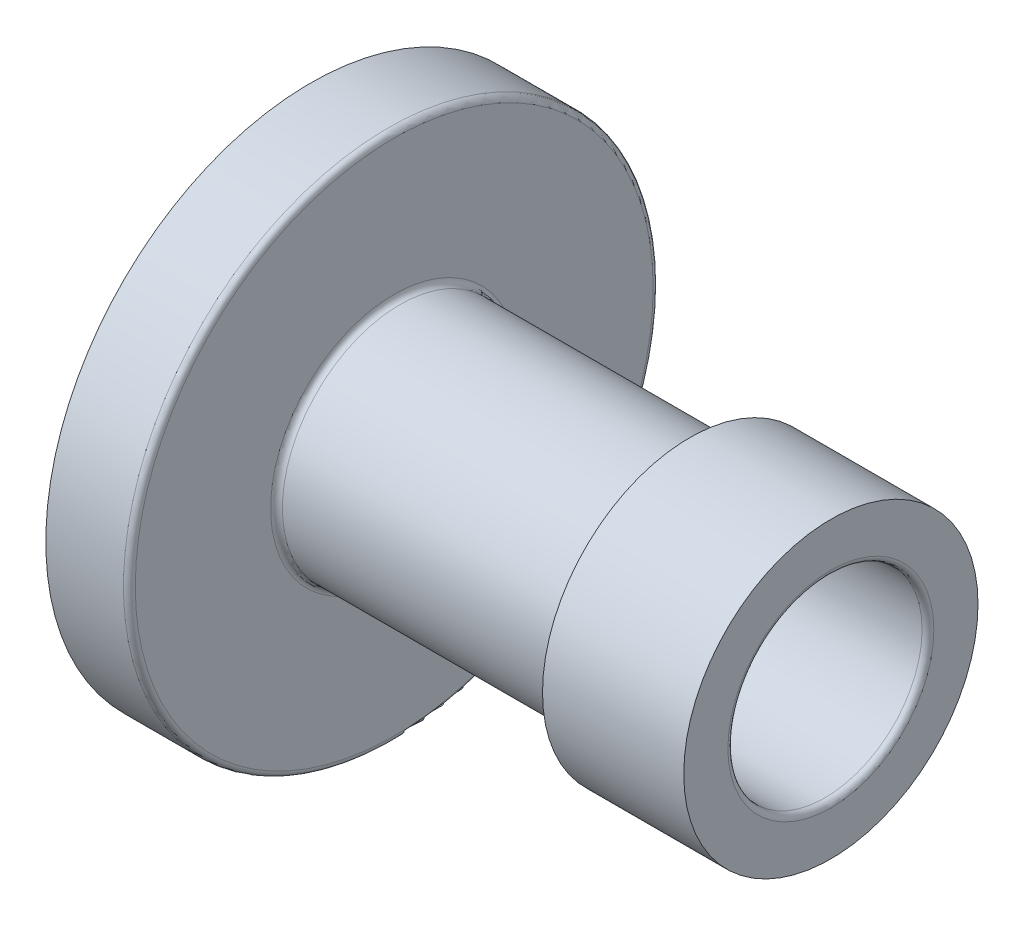
ISO-10303-21;
HEADER;
FILE_DESCRIPTION(('STEP AP214'),'2;1');
FILE_NAME('part.step','',(''),(''),'','','');
FILE_SCHEMA(('AUTOMOTIVE_DESIGN { 1 0 10303 214 1 1 1 1 }'));
ENDSEC;
DATA;
#1=APPLICATION_CONTEXT('core data for automotive mechanical design processes');
#2=APPLICATION_PROTOCOL_DEFINITION('international standard','automotive_design',2000,#1);
#3=PRODUCT_CONTEXT('',#1,'mechanical');
#4=PRODUCT('Part','Part','',(#3));
#5=PRODUCT_RELATED_PRODUCT_CATEGORY('part','',(#4));
#6=PRODUCT_DEFINITION_FORMATION('','',#4);
#7=PRODUCT_DEFINITION_CONTEXT('part definition',#1,'design');
#8=PRODUCT_DEFINITION('design','',#6,#7);
#9=PRODUCT_DEFINITION_SHAPE('','',#8);
#10=(LENGTH_UNIT() NAMED_UNIT(*) SI_UNIT(.MILLI.,.METRE.));
#11=(NAMED_UNIT(*) PLANE_ANGLE_UNIT() SI_UNIT($,.RADIAN.));
#12=(NAMED_UNIT(*) SI_UNIT($,.STERADIAN.) SOLID_ANGLE_UNIT());
#13=UNCERTAINTY_MEASURE_WITH_UNIT(LENGTH_MEASURE(1.E-05),#10,'distance_accuracy_value','');
#14=(GEOMETRIC_REPRESENTATION_CONTEXT(3) GLOBAL_UNCERTAINTY_ASSIGNED_CONTEXT((#13)) GLOBAL_UNIT_ASSIGNED_CONTEXT((#10,
#11,#12)) REPRESENTATION_CONTEXT('',''));
#15=CARTESIAN_POINT('',(0.,0.,0.));
#16=DIRECTION('',(0.,0.,1.));
#17=DIRECTION('',(1.,0.,0.));
#18=AXIS2_PLACEMENT_3D('',#15,#16,#17);
#19=CARTESIAN_POINT('',(-44.2,15.,0.));
#20=DIRECTION('',(-1.,0.,0.));
#21=DIRECTION('',(0.,0.,1.));
#22=AXIS2_PLACEMENT_3D('',#19,#20,#21);
#23=PLANE('',#22);
#24=CARTESIAN_POINT('',(-44.2,15.,0.));
#25=DIRECTION('',(1.,0.,0.));
#26=DIRECTION('',(0.,0.,-1.));
#27=AXIS2_PLACEMENT_3D('',#24,#25,#26);
#28=CIRCLE('',#27,15.);
#29=CARTESIAN_POINT('',(-44.2,15.,-15.));
#30=VERTEX_POINT('',#29);
#31=EDGE_CURVE('E80',#30,#30,#28,.T.);
#32=ORIENTED_EDGE('',*,*,#31,.T.);
#33=EDGE_LOOP('',(#32));
#34=FACE_BOUND('',#33,.T.);
#35=CARTESIAN_POINT('',(-44.2,15.,0.));
#36=DIRECTION('',(1.,0.,0.));
#37=DIRECTION('',(0.,0.,-1.));
#38=AXIS2_PLACEMENT_3D('',#35,#36,#37);
#39=CIRCLE('',#38,45.);
#40=CARTESIAN_POINT('',(-44.2,15.,-45.));
#41=VERTEX_POINT('',#40);
#42=EDGE_CURVE('E75',#41,#41,#39,.T.);
#43=ORIENTED_EDGE('',*,*,#42,.F.);
#44=EDGE_LOOP('',(#43));
#45=FACE_BOUND('',#44,.T.);
#46=ADVANCED_FACE('F43',(#34,#45),#23,.T.);
#47=CARTESIAN_POINT('',(44.2,15.,0.));
#48=DIRECTION('',(1.,0.,0.));
#49=DIRECTION('',(0.,0.,-1.));
#50=AXIS2_PLACEMENT_3D('',#47,#48,#49);
#51=CYLINDRICAL_SURFACE('',#50,45.);
#52=CARTESIAN_POINT('',(-31.,15.,0.));
#53=DIRECTION('',(1.,0.,0.));
#54=DIRECTION('',(0.,0.,-1.));
#55=AXIS2_PLACEMENT_3D('',#52,#53,#54);
#56=CIRCLE('',#55,45.);
#57=CARTESIAN_POINT('',(-31.,15.,-45.));
#58=VERTEX_POINT('',#57);
#59=EDGE_CURVE('E56',#58,#58,#56,.F.);
#60=ORIENTED_EDGE('',*,*,#59,.T.);
#61=EDGE_LOOP('',(#60));
#62=FACE_BOUND('',#61,.T.);
#63=ORIENTED_EDGE('',*,*,#42,.T.);
#64=EDGE_LOOP('',(#63));
#65=FACE_BOUND('',#64,.T.);
#66=ADVANCED_FACE('F122',(#62,#65),#51,.T.);
#67=CARTESIAN_POINT('',(-30.,60.,0.));
#68=DIRECTION('',(1.,0.,0.));
#69=DIRECTION('',(0.,0.,-1.));
#70=AXIS2_PLACEMENT_3D('',#67,#68,#69);
#71=PLANE('',#70);
#72=CARTESIAN_POINT('',(-30.,15.,0.));
#73=DIRECTION('',(1.,0.,0.));
#74=DIRECTION('',(0.,0.,-1.));
#75=AXIS2_PLACEMENT_3D('',#72,#73,#74);
#76=CIRCLE('',#75,21.);
#77=CARTESIAN_POINT('',(-30.,15.,-21.));
#78=VERTEX_POINT('',#77);
#79=EDGE_CURVE('E61',#78,#78,#76,.F.);
#80=ORIENTED_EDGE('',*,*,#79,.T.);
#81=EDGE_LOOP('',(#80));
#82=FACE_BOUND('',#81,.T.);
#83=CARTESIAN_POINT('',(-30.,15.,0.));
#84=DIRECTION('',(1.,0.,0.));
#85=DIRECTION('',(0.,0.,-1.));
#86=AXIS2_PLACEMENT_3D('',#83,#84,#85);
#87=CIRCLE('',#86,44.);
#88=CARTESIAN_POINT('',(-30.,15.,-44.));
#89=VERTEX_POINT('',#88);
#90=EDGE_CURVE('E67',#89,#89,#87,.T.);
#91=ORIENTED_EDGE('',*,*,#90,.T.);
#92=EDGE_LOOP('',(#91));
#93=FACE_BOUND('',#92,.T.);
#94=ADVANCED_FACE('F130',(#82,#93),#71,.T.);
#95=CARTESIAN_POINT('',(44.2,15.,0.));
#96=DIRECTION('',(1.,0.,0.));
#97=DIRECTION('',(0.,0.,-1.));
#98=AXIS2_PLACEMENT_3D('',#95,#96,#97);
#99=CYLINDRICAL_SURFACE('',#98,20.);
#100=CARTESIAN_POINT('',(-29.,15.,0.));
#101=DIRECTION('',(1.,0.,0.));
#102=DIRECTION('',(0.,0.,-1.));
#103=AXIS2_PLACEMENT_3D('',#100,#101,#102);
#104=CIRCLE('',#103,20.);
#105=CARTESIAN_POINT('',(-29.,15.,-20.));
#106=VERTEX_POINT('',#105);
#107=EDGE_CURVE('E71',#106,#106,#104,.T.);
#108=ORIENTED_EDGE('',*,*,#107,.T.);
#109=EDGE_LOOP('',(#108));
#110=FACE_BOUND('',#109,.T.);
#111=CARTESIAN_POINT('',(20.2,15.,0.));
#112=DIRECTION('',(1.,0.,0.));
#113=DIRECTION('',(0.,0.,-1.));
#114=AXIS2_PLACEMENT_3D('',#111,#112,#113);
#115=CIRCLE('',#114,20.);
#116=CARTESIAN_POINT('',(20.2,15.,-20.));
#117=VERTEX_POINT('',#116);
#118=EDGE_CURVE('E85',#117,#117,#115,.T.);
#119=ORIENTED_EDGE('',*,*,#118,.F.);
#120=EDGE_LOOP('',(#119));
#121=FACE_BOUND('',#120,.T.);
#122=ADVANCED_FACE('F146',(#110,#121),#99,.T.);
#123=CARTESIAN_POINT('',(20.2,35.,0.));
#124=DIRECTION('',(-1.,0.,0.));
#125=DIRECTION('',(0.,0.,1.));
#126=AXIS2_PLACEMENT_3D('',#123,#124,#125);
#127=PLANE('',#126);
#128=ORIENTED_EDGE('',*,*,#118,.T.);
#129=EDGE_LOOP('',(#128));
#130=FACE_BOUND('',#129,.T.);
#131=CARTESIAN_POINT('',(20.2,15.,0.));
#132=DIRECTION('',(1.,0.,0.));
#133=DIRECTION('',(0.,0.,-1.));
#134=AXIS2_PLACEMENT_3D('',#131,#132,#133);
#135=CIRCLE('',#134,25.);
#136=CARTESIAN_POINT('',(20.2,15.,-25.));
#137=VERTEX_POINT('',#136);
#138=EDGE_CURVE('E89',#137,#137,#135,.T.);
#139=ORIENTED_EDGE('',*,*,#138,.F.);
#140=EDGE_LOOP('',(#139));
#141=FACE_BOUND('',#140,.T.);
#142=ADVANCED_FACE('F151',(#130,#141),#127,.T.);
#143=CARTESIAN_POINT('',(44.2,15.,0.));
#144=DIRECTION('',(1.,0.,0.));
#145=DIRECTION('',(0.,0.,-1.));
#146=AXIS2_PLACEMENT_3D('',#143,#144,#145);
#147=CYLINDRICAL_SURFACE('',#146,25.);
#148=ORIENTED_EDGE('',*,*,#138,.T.);
#149=EDGE_LOOP('',(#148));
#150=FACE_BOUND('',#149,.T.);
#151=CARTESIAN_POINT('',(44.2,15.,0.));
#152=DIRECTION('',(1.,0.,0.));
#153=DIRECTION('',(0.,0.,-1.));
#154=AXIS2_PLACEMENT_3D('',#151,#152,#153);
#155=CIRCLE('',#154,25.);
#156=CARTESIAN_POINT('',(44.2,15.,-25.));
#157=VERTEX_POINT('',#156);
#158=EDGE_CURVE('E93',#157,#157,#155,.T.);
#159=ORIENTED_EDGE('',*,*,#158,.F.);
#160=EDGE_LOOP('',(#159));
#161=FACE_BOUND('',#160,.T.);
#162=ADVANCED_FACE('F157',(#150,#161),#147,.T.);
#163=CARTESIAN_POINT('',(44.2,40.,0.));
#164=DIRECTION('',(1.,0.,0.));
#165=DIRECTION('',(0.,0.,-1.));
#166=AXIS2_PLACEMENT_3D('',#163,#164,#165);
#167=PLANE('',#166);
#168=CARTESIAN_POINT('',(44.2,15.,0.));
#169=DIRECTION('',(1.,0.,0.));
#170=DIRECTION('',(0.,0.,-1.));
#171=AXIS2_PLACEMENT_3D('',#168,#169,#170);
#172=CIRCLE('',#171,17.5);
#173=CARTESIAN_POINT('',(44.2,15.,-17.5));
#174=VERTEX_POINT('',#173);
#175=EDGE_CURVE('E10',#174,#174,#172,.F.);
#176=ORIENTED_EDGE('',*,*,#175,.T.);
#177=EDGE_LOOP('',(#176));
#178=FACE_BOUND('',#177,.T.);
#179=ORIENTED_EDGE('',*,*,#158,.T.);
#180=EDGE_LOOP('',(#179));
#181=FACE_BOUND('',#180,.T.);
#182=ADVANCED_FACE('F160',(#178,#181),#167,.T.);
#183=CARTESIAN_POINT('',(44.2,15.,0.));
#184=DIRECTION('',(1.,0.,0.));
#185=DIRECTION('',(0.,0.,-1.));
#186=AXIS2_PLACEMENT_3D('',#183,#184,#185);
#187=CYLINDRICAL_SURFACE('',#186,15.);
#188=CARTESIAN_POINT('',(14.2,15.,0.));
#189=DIRECTION('',(-1.,0.,0.));
#190=DIRECTION('',(0.,0.,1.));
#191=AXIS2_PLACEMENT_3D('',#188,#189,#190);
#192=CIRCLE('',#191,15.);
#193=CARTESIAN_POINT('',(14.2,15.,15.));
#194=VERTEX_POINT('',#193);
#195=EDGE_CURVE('E76',#194,#194,#192,.F.);
#196=ORIENTED_EDGE('',*,*,#195,.T.);
#197=EDGE_LOOP('',(#196));
#198=FACE_BOUND('',#197,.T.);
#199=ORIENTED_EDGE('',*,*,#31,.F.);
#200=EDGE_LOOP('',(#199));
#201=FACE_BOUND('',#200,.T.);
#202=ADVANCED_FACE('F119',(#198,#201),#187,.F.);
#203=CARTESIAN_POINT('',(14.2,15.,0.));
#204=DIRECTION('',(-1.,0.,0.));
#205=DIRECTION('',(0.,0.,1.));
#206=AXIS2_PLACEMENT_3D('',#203,#204,#205);
#207=PLANE('',#206);
#208=CARTESIAN_POINT('',(14.2,15.,0.));
#209=DIRECTION('',(1.,0.,0.));
#210=DIRECTION('',(0.,0.,-1.));
#211=AXIS2_PLACEMENT_3D('',#208,#209,#210);
#212=CIRCLE('',#211,16.5);
#213=CARTESIAN_POINT('',(14.2,15.,-16.5));
#214=VERTEX_POINT('',#213);
#215=EDGE_CURVE('E81',#214,#214,#212,.T.);
#216=ORIENTED_EDGE('',*,*,#215,.T.);
#217=EDGE_LOOP('',(#216));
#218=FACE_BOUND('',#217,.T.);
#219=ORIENTED_EDGE('',*,*,#195,.F.);
#220=EDGE_LOOP('',(#219));
#221=FACE_BOUND('',#220,.T.);
#222=ADVANCED_FACE('F104',(#218,#221),#207,.F.);
#223=CARTESIAN_POINT('',(44.2,15.,0.));
#224=DIRECTION('',(1.,0.,0.));
#225=DIRECTION('',(0.,0.,-1.));
#226=AXIS2_PLACEMENT_3D('',#223,#224,#225);
#227=CYLINDRICAL_SURFACE('',#226,16.5);
#228=CARTESIAN_POINT('',(43.2,15.,0.));
#229=DIRECTION('',(1.,0.,0.));
#230=DIRECTION('',(0.,0.,-1.));
#231=AXIS2_PLACEMENT_3D('',#228,#229,#230);
#232=CIRCLE('',#231,16.5);
#233=CARTESIAN_POINT('',(43.2,15.,-16.5));
#234=VERTEX_POINT('',#233);
#235=EDGE_CURVE('E51',#234,#234,#232,.T.);
#236=ORIENTED_EDGE('',*,*,#235,.T.);
#237=EDGE_LOOP('',(#236));
#238=FACE_BOUND('',#237,.T.);
#239=ORIENTED_EDGE('',*,*,#215,.F.);
#240=EDGE_LOOP('',(#239));
#241=FACE_BOUND('',#240,.T.);
#242=ADVANCED_FACE('F107',(#238,#241),#227,.F.);
#243=CARTESIAN_POINT('',(-29.,15.,0.));
#244=DIRECTION('',(1.,0.,0.));
#245=DIRECTION('',(0.,0.,-1.));
#246=AXIS2_PLACEMENT_3D('',#243,#244,#245);
#247=TOROIDAL_SURFACE('',#246,21.,1.);
#248=ORIENTED_EDGE('',*,*,#79,.F.);
#249=EDGE_LOOP('',(#248));
#250=FACE_BOUND('',#249,.T.);
#251=ORIENTED_EDGE('',*,*,#107,.F.);
#252=EDGE_LOOP('',(#251));
#253=FACE_BOUND('',#252,.T.);
#254=ADVANCED_FACE('F109',(#250,#253),#247,.F.);
#255=CARTESIAN_POINT('',(-31.,15.,0.));
#256=DIRECTION('',(1.,0.,0.));
#257=DIRECTION('',(0.,0.,-1.));
#258=AXIS2_PLACEMENT_3D('',#255,#256,#257);
#259=TOROIDAL_SURFACE('',#258,44.,1.);
#260=ORIENTED_EDGE('',*,*,#59,.F.);
#261=EDGE_LOOP('',(#260));
#262=FACE_BOUND('',#261,.T.);
#263=ORIENTED_EDGE('',*,*,#90,.F.);
#264=EDGE_LOOP('',(#263));
#265=FACE_BOUND('',#264,.T.);
#266=ADVANCED_FACE('F115',(#262,#265),#259,.T.);
#267=CARTESIAN_POINT('',(43.2,15.,0.));
#268=DIRECTION('',(1.,0.,0.));
#269=DIRECTION('',(0.,0.,-1.));
#270=AXIS2_PLACEMENT_3D('',#267,#268,#269);
#271=TOROIDAL_SURFACE('',#270,17.5,1.);
#272=ORIENTED_EDGE('',*,*,#175,.F.);
#273=EDGE_LOOP('',(#272));
#274=FACE_BOUND('',#273,.T.);
#275=ORIENTED_EDGE('',*,*,#235,.F.);
#276=EDGE_LOOP('',(#275));
#277=FACE_BOUND('',#276,.T.);
#278=ADVANCED_FACE('F45',(#274,#277),#271,.T.);
#279=CLOSED_SHELL('',(#46,#66,#94,#122,#142,#162,#182,#202,#222,#242,#254,#266,#278));
#280=MANIFOLD_SOLID_BREP('B2',#279);
#281=ADVANCED_BREP_SHAPE_REPRESENTATION('',(#18,#280),#14);
#282=SHAPE_DEFINITION_REPRESENTATION(#9,#281);
ENDSEC;
END-ISO-10303-21;
